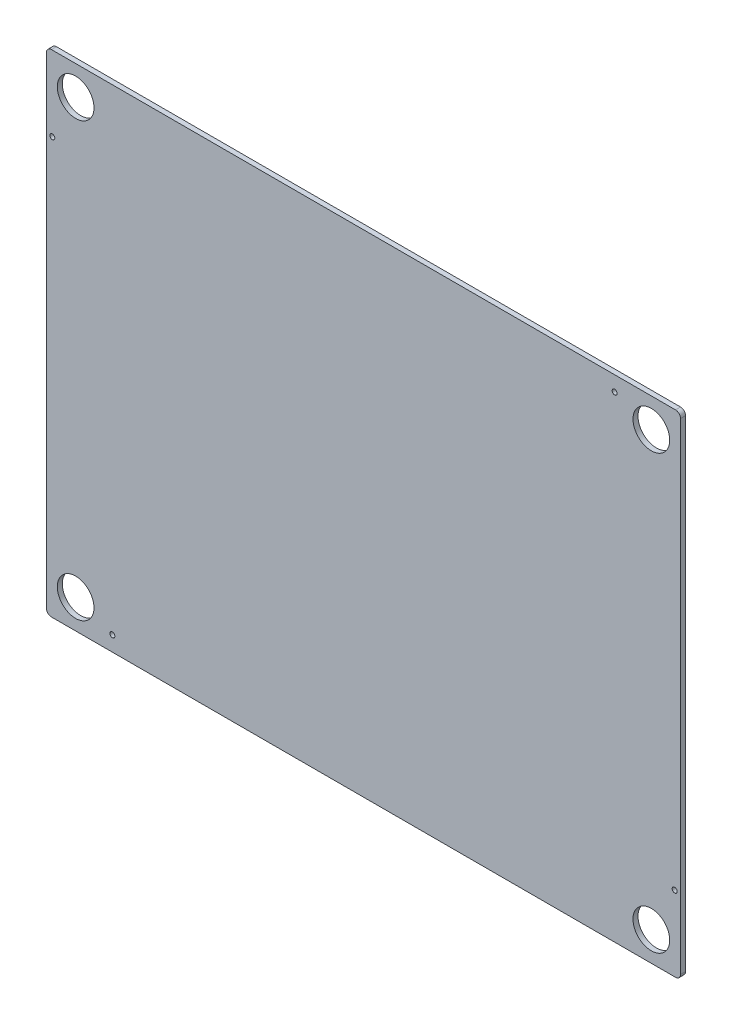
ISO-10303-21;
HEADER;
FILE_DESCRIPTION(('STEP AP214'),'2;1');
FILE_NAME('part.step','',(''),(''),'','','');
FILE_SCHEMA(('AUTOMOTIVE_DESIGN { 1 0 10303 214 1 1 1 1 }'));
ENDSEC;
DATA;
#1=APPLICATION_CONTEXT('core data for automotive mechanical design processes');
#2=APPLICATION_PROTOCOL_DEFINITION('international standard','automotive_design',2000,#1);
#3=PRODUCT_CONTEXT('',#1,'mechanical');
#4=PRODUCT('Part','Part','',(#3));
#5=PRODUCT_RELATED_PRODUCT_CATEGORY('part','',(#4));
#6=PRODUCT_DEFINITION_FORMATION('','',#4);
#7=PRODUCT_DEFINITION_CONTEXT('part definition',#1,'design');
#8=PRODUCT_DEFINITION('design','',#6,#7);
#9=PRODUCT_DEFINITION_SHAPE('','',#8);
#10=(LENGTH_UNIT() NAMED_UNIT(*) SI_UNIT(.MILLI.,.METRE.));
#11=(NAMED_UNIT(*) PLANE_ANGLE_UNIT() SI_UNIT($,.RADIAN.));
#12=(NAMED_UNIT(*) SI_UNIT($,.STERADIAN.) SOLID_ANGLE_UNIT());
#13=UNCERTAINTY_MEASURE_WITH_UNIT(LENGTH_MEASURE(1.E-05),#10,'distance_accuracy_value','');
#14=(GEOMETRIC_REPRESENTATION_CONTEXT(3) GLOBAL_UNCERTAINTY_ASSIGNED_CONTEXT((#13)) GLOBAL_UNIT_ASSIGNED_CONTEXT((#10,
#11,#12)) REPRESENTATION_CONTEXT('',''));
#15=CARTESIAN_POINT('',(0.,0.,0.));
#16=DIRECTION('',(0.,0.,1.));
#17=DIRECTION('',(1.,0.,0.));
#18=AXIS2_PLACEMENT_3D('',#15,#16,#17);
#19=CARTESIAN_POINT('',(0.,0.,3.));
#20=DIRECTION('',(0.,0.,1.));
#21=DIRECTION('',(1.,0.,0.));
#22=AXIS2_PLACEMENT_3D('',#19,#20,#21);
#23=PLANE('',#22);
#24=CARTESIAN_POINT('',(-150.499999999996,-138.250000000009,3.));
#25=DIRECTION('',(0.,0.,1.));
#26=DIRECTION('',(1.,0.,0.));
#27=AXIS2_PLACEMENT_3D('',#24,#25,#26);
#28=CIRCLE('',#27,1.49999999999875);
#29=CARTESIAN_POINT('',(-148.999999999997,-138.250000000009,3.));
#30=VERTEX_POINT('',#29);
#31=EDGE_CURVE('E216',#30,#30,#28,.T.);
#32=ORIENTED_EDGE('',*,*,#31,.F.);
#33=EDGE_LOOP('',(#32));
#34=FACE_BOUND('',#33,.T.);
#35=CARTESIAN_POINT('',(150.500000000004,138.249999999999,3.));
#36=DIRECTION('',(0.,0.,1.));
#37=DIRECTION('',(1.,0.,0.));
#38=AXIS2_PLACEMENT_3D('',#35,#36,#37);
#39=CIRCLE('',#38,1.50000000001802);
#40=CARTESIAN_POINT('',(152.000000000022,138.249999999999,3.));
#41=VERTEX_POINT('',#40);
#42=EDGE_CURVE('E204',#41,#41,#39,.T.);
#43=ORIENTED_EDGE('',*,*,#42,.F.);
#44=EDGE_LOOP('',(#43));
#45=FACE_BOUND('',#44,.T.);
#46=CARTESIAN_POINT('',(172.5,-129.749999999997,3.));
#47=DIRECTION('',(0.,0.,1.));
#48=DIRECTION('',(1.,0.,0.));
#49=AXIS2_PLACEMENT_3D('',#46,#47,#48);
#50=CIRCLE('',#49,11.);
#51=CARTESIAN_POINT('',(183.5,-129.749999999997,3.));
#52=VERTEX_POINT('',#51);
#53=EDGE_CURVE('E192',#52,#52,#50,.T.);
#54=ORIENTED_EDGE('',*,*,#53,.F.);
#55=EDGE_LOOP('',(#54));
#56=FACE_BOUND('',#55,.T.);
#57=CARTESIAN_POINT('',(-172.5,129.749999999997,3.));
#58=DIRECTION('',(0.,0.,1.));
#59=DIRECTION('',(1.,0.,0.));
#60=AXIS2_PLACEMENT_3D('',#57,#58,#59);
#61=CIRCLE('',#60,11.);
#62=CARTESIAN_POINT('',(-161.5,129.749999999997,3.));
#63=VERTEX_POINT('',#62);
#64=EDGE_CURVE('E182',#63,#63,#61,.T.);
#65=ORIENTED_EDGE('',*,*,#64,.F.);
#66=EDGE_LOOP('',(#65));
#67=FACE_BOUND('',#66,.T.);
#68=DIRECTION('',(1.,0.,0.));
#69=VECTOR('',#68,1.);
#70=CARTESIAN_POINT('',(190.,-147.250000000003,3.));
#71=LINE('',#70,#69);
#72=CARTESIAN_POINT('',(-187.,-147.250000000003,3.));
#73=VERTEX_POINT('',#72);
#74=CARTESIAN_POINT('',(187.,-147.250000000003,3.));
#75=VERTEX_POINT('',#74);
#76=EDGE_CURVE('E173',#73,#75,#71,.T.);
#77=ORIENTED_EDGE('',*,*,#76,.T.);
#78=CARTESIAN_POINT('',(187.,-144.250000000003,3.));
#79=DIRECTION('',(0.,0.,1.));
#80=DIRECTION('',(1.,0.,0.));
#81=AXIS2_PLACEMENT_3D('',#78,#79,#80);
#82=CIRCLE('',#81,3.);
#83=CARTESIAN_POINT('',(190.,-144.250000000003,3.));
#84=VERTEX_POINT('',#83);
#85=EDGE_CURVE('E151',#75,#84,#82,.T.);
#86=ORIENTED_EDGE('',*,*,#85,.T.);
#87=DIRECTION('',(0.,1.,0.));
#88=VECTOR('',#87,1.);
#89=CARTESIAN_POINT('',(190.,-147.250000000003,3.));
#90=LINE('',#89,#88);
#91=CARTESIAN_POINT('',(190.,144.249999999997,3.));
#92=VERTEX_POINT('',#91);
#93=EDGE_CURVE('E121',#84,#92,#90,.T.);
#94=ORIENTED_EDGE('',*,*,#93,.T.);
#95=CARTESIAN_POINT('',(187.,144.249999999997,3.));
#96=DIRECTION('',(0.,0.,1.));
#97=DIRECTION('',(1.,0.,0.));
#98=AXIS2_PLACEMENT_3D('',#95,#96,#97);
#99=CIRCLE('',#98,3.);
#100=CARTESIAN_POINT('',(187.,147.249999999997,3.));
#101=VERTEX_POINT('',#100);
#102=EDGE_CURVE('E57',#92,#101,#99,.T.);
#103=ORIENTED_EDGE('',*,*,#102,.T.);
#104=DIRECTION('',(-1.,0.,0.));
#105=VECTOR('',#104,1.);
#106=CARTESIAN_POINT('',(190.,147.249999999997,3.));
#107=LINE('',#106,#105);
#108=CARTESIAN_POINT('',(-187.,147.249999999997,3.));
#109=VERTEX_POINT('',#108);
#110=EDGE_CURVE('E137',#101,#109,#107,.T.);
#111=ORIENTED_EDGE('',*,*,#110,.T.);
#112=CARTESIAN_POINT('',(-187.,144.249999999997,3.));
#113=DIRECTION('',(0.,0.,1.));
#114=DIRECTION('',(1.,0.,0.));
#115=AXIS2_PLACEMENT_3D('',#112,#113,#114);
#116=CIRCLE('',#115,3.);
#117=CARTESIAN_POINT('',(-190.,144.249999999997,3.));
#118=VERTEX_POINT('',#117);
#119=EDGE_CURVE('E147',#109,#118,#116,.T.);
#120=ORIENTED_EDGE('',*,*,#119,.T.);
#121=DIRECTION('',(0.,-1.,0.));
#122=VECTOR('',#121,1.);
#123=CARTESIAN_POINT('',(-190.,-147.250000000003,3.));
#124=LINE('',#123,#122);
#125=CARTESIAN_POINT('',(-190.,-144.250000000003,3.));
#126=VERTEX_POINT('',#125);
#127=EDGE_CURVE('E131',#118,#126,#124,.T.);
#128=ORIENTED_EDGE('',*,*,#127,.T.);
#129=CARTESIAN_POINT('',(-187.,-144.250000000003,3.));
#130=DIRECTION('',(0.,0.,1.));
#131=DIRECTION('',(1.,0.,0.));
#132=AXIS2_PLACEMENT_3D('',#129,#130,#131);
#133=CIRCLE('',#132,3.);
#134=EDGE_CURVE('E149',#126,#73,#133,.T.);
#135=ORIENTED_EDGE('',*,*,#134,.T.);
#136=EDGE_LOOP('',(#77,#86,#94,#103,#111,#120,#128,#135));
#137=FACE_BOUND('',#136,.T.);
#138=CARTESIAN_POINT('',(172.5,129.749999999997,3.));
#139=DIRECTION('',(0.,0.,1.));
#140=DIRECTION('',(-1.,0.,0.));
#141=AXIS2_PLACEMENT_3D('',#138,#139,#140);
#142=CIRCLE('',#141,11.);
#143=CARTESIAN_POINT('',(161.5,129.749999999997,3.));
#144=VERTEX_POINT('',#143);
#145=EDGE_CURVE('E187',#144,#144,#142,.T.);
#146=ORIENTED_EDGE('',*,*,#145,.F.);
#147=EDGE_LOOP('',(#146));
#148=FACE_BOUND('',#147,.T.);
#149=CARTESIAN_POINT('',(-172.5,-129.749999999997,3.));
#150=DIRECTION('',(0.,0.,1.));
#151=DIRECTION('',(-1.,0.,0.));
#152=AXIS2_PLACEMENT_3D('',#149,#150,#151);
#153=CIRCLE('',#152,11.);
#154=CARTESIAN_POINT('',(-183.5,-129.749999999997,3.));
#155=VERTEX_POINT('',#154);
#156=EDGE_CURVE('E198',#155,#155,#153,.T.);
#157=ORIENTED_EDGE('',*,*,#156,.F.);
#158=EDGE_LOOP('',(#157));
#159=FACE_BOUND('',#158,.T.);
#160=CARTESIAN_POINT('',(-186.499999999993,102.25,3.));
#161=DIRECTION('',(0.,0.,1.));
#162=DIRECTION('',(1.,0.,0.));
#163=AXIS2_PLACEMENT_3D('',#160,#161,#162);
#164=CIRCLE('',#163,1.49999999999387);
#165=CARTESIAN_POINT('',(-185.,102.25,3.));
#166=VERTEX_POINT('',#165);
#167=EDGE_CURVE('E210',#166,#166,#164,.T.);
#168=ORIENTED_EDGE('',*,*,#167,.F.);
#169=EDGE_LOOP('',(#168));
#170=FACE_BOUND('',#169,.T.);
#171=CARTESIAN_POINT('',(186.500000000006,-102.250000000003,3.));
#172=DIRECTION('',(0.,0.,1.));
#173=DIRECTION('',(1.,0.,0.));
#174=AXIS2_PLACEMENT_3D('',#171,#172,#173);
#175=CIRCLE('',#174,1.49999999999547);
#176=CARTESIAN_POINT('',(188.000000000001,-102.250000000003,3.));
#177=VERTEX_POINT('',#176);
#178=EDGE_CURVE('E222',#177,#177,#175,.T.);
#179=ORIENTED_EDGE('',*,*,#178,.F.);
#180=EDGE_LOOP('',(#179));
#181=FACE_BOUND('',#180,.T.);
#182=ADVANCED_FACE('F37',(#34,#45,#56,#67,#137,#148,#159,#170,#181),#23,.T.);
#183=CARTESIAN_POINT('',(0.,0.,0.));
#184=DIRECTION('',(0.,0.,1.));
#185=DIRECTION('',(1.,0.,0.));
#186=AXIS2_PLACEMENT_3D('',#183,#184,#185);
#187=PLANE('',#186);
#188=DIRECTION('',(0.,1.,0.));
#189=VECTOR('',#188,1.);
#190=CARTESIAN_POINT('',(190.,-147.250000000003,0.));
#191=LINE('',#190,#189);
#192=CARTESIAN_POINT('',(190.,-144.250000000003,0.));
#193=VERTEX_POINT('',#192);
#194=CARTESIAN_POINT('',(190.,144.249999999997,0.));
#195=VERTEX_POINT('',#194);
#196=EDGE_CURVE('E119',#193,#195,#191,.T.);
#197=ORIENTED_EDGE('',*,*,#196,.F.);
#198=CARTESIAN_POINT('',(187.,-144.250000000003,0.));
#199=DIRECTION('',(0.,0.,1.));
#200=DIRECTION('',(1.,0.,0.));
#201=AXIS2_PLACEMENT_3D('',#198,#199,#200);
#202=CIRCLE('',#201,3.);
#203=CARTESIAN_POINT('',(187.,-147.250000000003,0.));
#204=VERTEX_POINT('',#203);
#205=EDGE_CURVE('E102',#193,#204,#202,.F.);
#206=ORIENTED_EDGE('',*,*,#205,.T.);
#207=DIRECTION('',(1.,0.,0.));
#208=VECTOR('',#207,1.);
#209=CARTESIAN_POINT('',(190.,-147.250000000003,0.));
#210=LINE('',#209,#208);
#211=CARTESIAN_POINT('',(-187.,-147.250000000003,0.));
#212=VERTEX_POINT('',#211);
#213=EDGE_CURVE('E129',#212,#204,#210,.T.);
#214=ORIENTED_EDGE('',*,*,#213,.F.);
#215=CARTESIAN_POINT('',(-187.,-144.250000000003,0.));
#216=DIRECTION('',(0.,0.,1.));
#217=DIRECTION('',(1.,0.,0.));
#218=AXIS2_PLACEMENT_3D('',#215,#216,#217);
#219=CIRCLE('',#218,3.);
#220=CARTESIAN_POINT('',(-190.,-144.250000000003,0.));
#221=VERTEX_POINT('',#220);
#222=EDGE_CURVE('E113',#212,#221,#219,.F.);
#223=ORIENTED_EDGE('',*,*,#222,.T.);
#224=DIRECTION('',(0.,-1.,0.));
#225=VECTOR('',#224,1.);
#226=CARTESIAN_POINT('',(-190.,-147.250000000003,0.));
#227=LINE('',#226,#225);
#228=CARTESIAN_POINT('',(-190.,144.249999999997,0.));
#229=VERTEX_POINT('',#228);
#230=EDGE_CURVE('E133',#229,#221,#227,.T.);
#231=ORIENTED_EDGE('',*,*,#230,.F.);
#232=CARTESIAN_POINT('',(-187.,144.249999999997,0.));
#233=DIRECTION('',(0.,0.,1.));
#234=DIRECTION('',(1.,0.,0.));
#235=AXIS2_PLACEMENT_3D('',#232,#233,#234);
#236=CIRCLE('',#235,3.);
#237=CARTESIAN_POINT('',(-187.,147.249999999997,0.));
#238=VERTEX_POINT('',#237);
#239=EDGE_CURVE('E140',#229,#238,#236,.F.);
#240=ORIENTED_EDGE('',*,*,#239,.T.);
#241=DIRECTION('',(-1.,0.,0.));
#242=VECTOR('',#241,1.);
#243=CARTESIAN_POINT('',(190.,147.249999999997,0.));
#244=LINE('',#243,#242);
#245=CARTESIAN_POINT('',(187.,147.249999999997,0.));
#246=VERTEX_POINT('',#245);
#247=EDGE_CURVE('E128',#246,#238,#244,.T.);
#248=ORIENTED_EDGE('',*,*,#247,.F.);
#249=CARTESIAN_POINT('',(187.,144.249999999997,0.));
#250=DIRECTION('',(0.,0.,1.));
#251=DIRECTION('',(1.,0.,0.));
#252=AXIS2_PLACEMENT_3D('',#249,#250,#251);
#253=CIRCLE('',#252,3.);
#254=EDGE_CURVE('E122',#246,#195,#253,.F.);
#255=ORIENTED_EDGE('',*,*,#254,.T.);
#256=EDGE_LOOP('',(#197,#206,#214,#223,#231,#240,#248,#255));
#257=FACE_BOUND('',#256,.T.);
#258=CARTESIAN_POINT('',(-172.5,129.749999999997,0.));
#259=DIRECTION('',(0.,0.,1.));
#260=DIRECTION('',(1.,0.,0.));
#261=AXIS2_PLACEMENT_3D('',#258,#259,#260);
#262=CIRCLE('',#261,11.);
#263=CARTESIAN_POINT('',(-161.5,129.749999999997,0.));
#264=VERTEX_POINT('',#263);
#265=EDGE_CURVE('E178',#264,#264,#262,.T.);
#266=ORIENTED_EDGE('',*,*,#265,.T.);
#267=EDGE_LOOP('',(#266));
#268=FACE_BOUND('',#267,.T.);
#269=CARTESIAN_POINT('',(172.5,129.749999999997,0.));
#270=DIRECTION('',(0.,0.,1.));
#271=DIRECTION('',(-1.,0.,0.));
#272=AXIS2_PLACEMENT_3D('',#269,#270,#271);
#273=CIRCLE('',#272,11.);
#274=CARTESIAN_POINT('',(161.5,129.749999999997,0.));
#275=VERTEX_POINT('',#274);
#276=EDGE_CURVE('E189',#275,#275,#273,.T.);
#277=ORIENTED_EDGE('',*,*,#276,.T.);
#278=EDGE_LOOP('',(#277));
#279=FACE_BOUND('',#278,.T.);
#280=CARTESIAN_POINT('',(172.5,-129.749999999997,0.));
#281=DIRECTION('',(0.,0.,1.));
#282=DIRECTION('',(1.,0.,0.));
#283=AXIS2_PLACEMENT_3D('',#280,#281,#282);
#284=CIRCLE('',#283,11.);
#285=CARTESIAN_POINT('',(183.5,-129.749999999997,0.));
#286=VERTEX_POINT('',#285);
#287=EDGE_CURVE('E195',#286,#286,#284,.T.);
#288=ORIENTED_EDGE('',*,*,#287,.T.);
#289=EDGE_LOOP('',(#288));
#290=FACE_BOUND('',#289,.T.);
#291=CARTESIAN_POINT('',(-172.5,-129.749999999997,0.));
#292=DIRECTION('',(0.,0.,1.));
#293=DIRECTION('',(-1.,0.,0.));
#294=AXIS2_PLACEMENT_3D('',#291,#292,#293);
#295=CIRCLE('',#294,11.);
#296=CARTESIAN_POINT('',(-183.5,-129.749999999997,0.));
#297=VERTEX_POINT('',#296);
#298=EDGE_CURVE('E201',#297,#297,#295,.T.);
#299=ORIENTED_EDGE('',*,*,#298,.T.);
#300=EDGE_LOOP('',(#299));
#301=FACE_BOUND('',#300,.T.);
#302=CARTESIAN_POINT('',(150.500000000004,138.249999999999,0.));
#303=DIRECTION('',(0.,0.,1.));
#304=DIRECTION('',(1.,0.,0.));
#305=AXIS2_PLACEMENT_3D('',#302,#303,#304);
#306=CIRCLE('',#305,1.50000000001802);
#307=CARTESIAN_POINT('',(152.000000000022,138.249999999999,0.));
#308=VERTEX_POINT('',#307);
#309=EDGE_CURVE('E207',#308,#308,#306,.T.);
#310=ORIENTED_EDGE('',*,*,#309,.T.);
#311=EDGE_LOOP('',(#310));
#312=FACE_BOUND('',#311,.T.);
#313=CARTESIAN_POINT('',(-186.499999999993,102.25,0.));
#314=DIRECTION('',(0.,0.,1.));
#315=DIRECTION('',(1.,0.,0.));
#316=AXIS2_PLACEMENT_3D('',#313,#314,#315);
#317=CIRCLE('',#316,1.49999999999387);
#318=CARTESIAN_POINT('',(-185.,102.25,0.));
#319=VERTEX_POINT('',#318);
#320=EDGE_CURVE('E213',#319,#319,#317,.T.);
#321=ORIENTED_EDGE('',*,*,#320,.T.);
#322=EDGE_LOOP('',(#321));
#323=FACE_BOUND('',#322,.T.);
#324=CARTESIAN_POINT('',(-150.499999999996,-138.250000000009,0.));
#325=DIRECTION('',(0.,0.,1.));
#326=DIRECTION('',(1.,0.,0.));
#327=AXIS2_PLACEMENT_3D('',#324,#325,#326);
#328=CIRCLE('',#327,1.49999999999875);
#329=CARTESIAN_POINT('',(-148.999999999997,-138.250000000009,0.));
#330=VERTEX_POINT('',#329);
#331=EDGE_CURVE('E219',#330,#330,#328,.T.);
#332=ORIENTED_EDGE('',*,*,#331,.T.);
#333=EDGE_LOOP('',(#332));
#334=FACE_BOUND('',#333,.T.);
#335=CARTESIAN_POINT('',(186.500000000006,-102.250000000003,0.));
#336=DIRECTION('',(0.,0.,1.));
#337=DIRECTION('',(1.,0.,0.));
#338=AXIS2_PLACEMENT_3D('',#335,#336,#337);
#339=CIRCLE('',#338,1.49999999999547);
#340=CARTESIAN_POINT('',(188.000000000001,-102.250000000003,0.));
#341=VERTEX_POINT('',#340);
#342=EDGE_CURVE('E225',#341,#341,#339,.T.);
#343=ORIENTED_EDGE('',*,*,#342,.T.);
#344=EDGE_LOOP('',(#343));
#345=FACE_BOUND('',#344,.T.);
#346=ADVANCED_FACE('F125',(#257,#268,#279,#290,#301,#312,#323,#334,#345),#187,.F.);
#347=CARTESIAN_POINT('',(-190.,-147.250000000003,3.));
#348=DIRECTION('',(1.,0.,0.));
#349=DIRECTION('',(0.,1.,0.));
#350=AXIS2_PLACEMENT_3D('',#347,#348,#349);
#351=PLANE('',#350);
#352=ORIENTED_EDGE('',*,*,#230,.T.);
#353=DIRECTION('',(0.,0.,-1.));
#354=VECTOR('',#353,1.);
#355=CARTESIAN_POINT('',(-190.,-144.250000000003,3.));
#356=LINE('',#355,#354);
#357=EDGE_CURVE('E156',#221,#126,#356,.F.);
#358=ORIENTED_EDGE('',*,*,#357,.T.);
#359=ORIENTED_EDGE('',*,*,#127,.F.);
#360=DIRECTION('',(0.,0.,-1.));
#361=VECTOR('',#360,1.);
#362=CARTESIAN_POINT('',(-190.,144.249999999997,3.));
#363=LINE('',#362,#361);
#364=EDGE_CURVE('E153',#118,#229,#363,.T.);
#365=ORIENTED_EDGE('',*,*,#364,.T.);
#366=EDGE_LOOP('',(#352,#358,#359,#365));
#367=FACE_BOUND('',#366,.T.);
#368=ADVANCED_FACE('F169',(#367),#351,.F.);
#369=CARTESIAN_POINT('',(190.,-147.250000000003,3.));
#370=DIRECTION('',(0.,1.,0.));
#371=DIRECTION('',(-1.,0.,0.));
#372=AXIS2_PLACEMENT_3D('',#369,#370,#371);
#373=PLANE('',#372);
#374=ORIENTED_EDGE('',*,*,#213,.T.);
#375=DIRECTION('',(0.,0.,-1.));
#376=VECTOR('',#375,1.);
#377=CARTESIAN_POINT('',(187.,-147.250000000003,3.));
#378=LINE('',#377,#376);
#379=EDGE_CURVE('E107',#204,#75,#378,.F.);
#380=ORIENTED_EDGE('',*,*,#379,.T.);
#381=ORIENTED_EDGE('',*,*,#76,.F.);
#382=DIRECTION('',(0.,0.,-1.));
#383=VECTOR('',#382,1.);
#384=CARTESIAN_POINT('',(-187.,-147.250000000003,3.));
#385=LINE('',#384,#383);
#386=EDGE_CURVE('E112',#73,#212,#385,.T.);
#387=ORIENTED_EDGE('',*,*,#386,.T.);
#388=EDGE_LOOP('',(#374,#380,#381,#387));
#389=FACE_BOUND('',#388,.T.);
#390=ADVANCED_FACE('F251',(#389),#373,.F.);
#391=CARTESIAN_POINT('',(190.,-147.250000000003,3.));
#392=DIRECTION('',(-1.,0.,0.));
#393=DIRECTION('',(0.,-1.,0.));
#394=AXIS2_PLACEMENT_3D('',#391,#392,#393);
#395=PLANE('',#394);
#396=ORIENTED_EDGE('',*,*,#93,.F.);
#397=DIRECTION('',(0.,0.,-1.));
#398=VECTOR('',#397,1.);
#399=CARTESIAN_POINT('',(190.,-144.250000000003,3.));
#400=LINE('',#399,#398);
#401=EDGE_CURVE('E106',#84,#193,#400,.T.);
#402=ORIENTED_EDGE('',*,*,#401,.T.);
#403=ORIENTED_EDGE('',*,*,#196,.T.);
#404=DIRECTION('',(0.,0.,-1.));
#405=VECTOR('',#404,1.);
#406=CARTESIAN_POINT('',(190.,144.249999999997,3.));
#407=LINE('',#406,#405);
#408=EDGE_CURVE('E123',#195,#92,#407,.F.);
#409=ORIENTED_EDGE('',*,*,#408,.T.);
#410=EDGE_LOOP('',(#396,#402,#403,#409));
#411=FACE_BOUND('',#410,.T.);
#412=ADVANCED_FACE('F118',(#411),#395,.F.);
#413=CARTESIAN_POINT('',(190.,147.249999999997,3.));
#414=DIRECTION('',(0.,-1.,0.));
#415=DIRECTION('',(1.,0.,0.));
#416=AXIS2_PLACEMENT_3D('',#413,#414,#415);
#417=PLANE('',#416);
#418=ORIENTED_EDGE('',*,*,#247,.T.);
#419=DIRECTION('',(0.,0.,-1.));
#420=VECTOR('',#419,1.);
#421=CARTESIAN_POINT('',(-187.,147.249999999997,3.));
#422=LINE('',#421,#420);
#423=EDGE_CURVE('E11',#238,#109,#422,.F.);
#424=ORIENTED_EDGE('',*,*,#423,.T.);
#425=ORIENTED_EDGE('',*,*,#110,.F.);
#426=DIRECTION('',(0.,0.,-1.));
#427=VECTOR('',#426,1.);
#428=CARTESIAN_POINT('',(187.,147.249999999997,3.));
#429=LINE('',#428,#427);
#430=EDGE_CURVE('E45',#101,#246,#429,.T.);
#431=ORIENTED_EDGE('',*,*,#430,.T.);
#432=EDGE_LOOP('',(#418,#424,#425,#431));
#433=FACE_BOUND('',#432,.T.);
#434=ADVANCED_FACE('F159',(#433),#417,.F.);
#435=CARTESIAN_POINT('',(-172.5,129.749999999997,3.));
#436=DIRECTION('',(0.,0.,-1.));
#437=DIRECTION('',(-1.,0.,0.));
#438=AXIS2_PLACEMENT_3D('',#435,#436,#437);
#439=CYLINDRICAL_SURFACE('',#438,11.);
#440=ORIENTED_EDGE('',*,*,#64,.T.);
#441=EDGE_LOOP('',(#440));
#442=FACE_BOUND('',#441,.T.);
#443=ORIENTED_EDGE('',*,*,#265,.F.);
#444=EDGE_LOOP('',(#443));
#445=FACE_BOUND('',#444,.T.);
#446=ADVANCED_FACE('F244',(#442,#445),#439,.F.);
#447=CARTESIAN_POINT('',(172.5,129.749999999997,3.));
#448=DIRECTION('',(0.,0.,-1.));
#449=DIRECTION('',(-1.,0.,0.));
#450=AXIS2_PLACEMENT_3D('',#447,#448,#449);
#451=CYLINDRICAL_SURFACE('',#450,11.);
#452=ORIENTED_EDGE('',*,*,#145,.T.);
#453=EDGE_LOOP('',(#452));
#454=FACE_BOUND('',#453,.T.);
#455=ORIENTED_EDGE('',*,*,#276,.F.);
#456=EDGE_LOOP('',(#455));
#457=FACE_BOUND('',#456,.T.);
#458=ADVANCED_FACE('F306',(#454,#457),#451,.F.);
#459=CARTESIAN_POINT('',(172.5,-129.749999999997,3.));
#460=DIRECTION('',(0.,0.,-1.));
#461=DIRECTION('',(-1.,0.,0.));
#462=AXIS2_PLACEMENT_3D('',#459,#460,#461);
#463=CYLINDRICAL_SURFACE('',#462,11.);
#464=ORIENTED_EDGE('',*,*,#53,.T.);
#465=EDGE_LOOP('',(#464));
#466=FACE_BOUND('',#465,.T.);
#467=ORIENTED_EDGE('',*,*,#287,.F.);
#468=EDGE_LOOP('',(#467));
#469=FACE_BOUND('',#468,.T.);
#470=ADVANCED_FACE('F303',(#466,#469),#463,.F.);
#471=CARTESIAN_POINT('',(-172.5,-129.749999999997,3.));
#472=DIRECTION('',(0.,0.,-1.));
#473=DIRECTION('',(-1.,0.,0.));
#474=AXIS2_PLACEMENT_3D('',#471,#472,#473);
#475=CYLINDRICAL_SURFACE('',#474,11.);
#476=ORIENTED_EDGE('',*,*,#156,.T.);
#477=EDGE_LOOP('',(#476));
#478=FACE_BOUND('',#477,.T.);
#479=ORIENTED_EDGE('',*,*,#298,.F.);
#480=EDGE_LOOP('',(#479));
#481=FACE_BOUND('',#480,.T.);
#482=ADVANCED_FACE('F299',(#478,#481),#475,.F.);
#483=CARTESIAN_POINT('',(150.500000000004,138.249999999999,3.));
#484=DIRECTION('',(0.,0.,-1.));
#485=DIRECTION('',(-1.,0.,0.));
#486=AXIS2_PLACEMENT_3D('',#483,#484,#485);
#487=CYLINDRICAL_SURFACE('',#486,1.50000000001802);
#488=ORIENTED_EDGE('',*,*,#42,.T.);
#489=EDGE_LOOP('',(#488));
#490=FACE_BOUND('',#489,.T.);
#491=ORIENTED_EDGE('',*,*,#309,.F.);
#492=EDGE_LOOP('',(#491));
#493=FACE_BOUND('',#492,.T.);
#494=ADVANCED_FACE('F281',(#490,#493),#487,.F.);
#495=CARTESIAN_POINT('',(-186.499999999993,102.25,3.));
#496=DIRECTION('',(0.,0.,-1.));
#497=DIRECTION('',(-1.,0.,0.));
#498=AXIS2_PLACEMENT_3D('',#495,#496,#497);
#499=CYLINDRICAL_SURFACE('',#498,1.49999999999387);
#500=ORIENTED_EDGE('',*,*,#167,.T.);
#501=EDGE_LOOP('',(#500));
#502=FACE_BOUND('',#501,.T.);
#503=ORIENTED_EDGE('',*,*,#320,.F.);
#504=EDGE_LOOP('',(#503));
#505=FACE_BOUND('',#504,.T.);
#506=ADVANCED_FACE('F277',(#502,#505),#499,.F.);
#507=CARTESIAN_POINT('',(-150.499999999996,-138.250000000009,3.));
#508=DIRECTION('',(0.,0.,-1.));
#509=DIRECTION('',(-1.,0.,0.));
#510=AXIS2_PLACEMENT_3D('',#507,#508,#509);
#511=CYLINDRICAL_SURFACE('',#510,1.49999999999875);
#512=ORIENTED_EDGE('',*,*,#31,.T.);
#513=EDGE_LOOP('',(#512));
#514=FACE_BOUND('',#513,.T.);
#515=ORIENTED_EDGE('',*,*,#331,.F.);
#516=EDGE_LOOP('',(#515));
#517=FACE_BOUND('',#516,.T.);
#518=ADVANCED_FACE('F280',(#514,#517),#511,.F.);
#519=CARTESIAN_POINT('',(186.500000000006,-102.250000000003,3.));
#520=DIRECTION('',(0.,0.,-1.));
#521=DIRECTION('',(-1.,0.,0.));
#522=AXIS2_PLACEMENT_3D('',#519,#520,#521);
#523=CYLINDRICAL_SURFACE('',#522,1.49999999999547);
#524=ORIENTED_EDGE('',*,*,#178,.T.);
#525=EDGE_LOOP('',(#524));
#526=FACE_BOUND('',#525,.T.);
#527=ORIENTED_EDGE('',*,*,#342,.F.);
#528=EDGE_LOOP('',(#527));
#529=FACE_BOUND('',#528,.T.);
#530=ADVANCED_FACE('F231',(#526,#529),#523,.F.);
#531=CARTESIAN_POINT('',(187.,-144.250000000003,3.));
#532=DIRECTION('',(0.,0.,-1.));
#533=DIRECTION('',(-1.,0.,0.));
#534=AXIS2_PLACEMENT_3D('',#531,#532,#533);
#535=CYLINDRICAL_SURFACE('',#534,3.);
#536=ORIENTED_EDGE('',*,*,#85,.F.);
#537=ORIENTED_EDGE('',*,*,#379,.F.);
#538=ORIENTED_EDGE('',*,*,#205,.F.);
#539=ORIENTED_EDGE('',*,*,#401,.F.);
#540=EDGE_LOOP('',(#536,#537,#538,#539));
#541=FACE_BOUND('',#540,.T.);
#542=ADVANCED_FACE('F105',(#541),#535,.T.);
#543=CARTESIAN_POINT('',(-187.,-144.250000000003,3.));
#544=DIRECTION('',(0.,0.,-1.));
#545=DIRECTION('',(-1.,0.,0.));
#546=AXIS2_PLACEMENT_3D('',#543,#544,#545);
#547=CYLINDRICAL_SURFACE('',#546,3.);
#548=ORIENTED_EDGE('',*,*,#134,.F.);
#549=ORIENTED_EDGE('',*,*,#357,.F.);
#550=ORIENTED_EDGE('',*,*,#222,.F.);
#551=ORIENTED_EDGE('',*,*,#386,.F.);
#552=EDGE_LOOP('',(#548,#549,#550,#551));
#553=FACE_BOUND('',#552,.T.);
#554=ADVANCED_FACE('F259',(#553),#547,.T.);
#555=CARTESIAN_POINT('',(-187.,144.249999999997,3.));
#556=DIRECTION('',(0.,0.,-1.));
#557=DIRECTION('',(-1.,0.,0.));
#558=AXIS2_PLACEMENT_3D('',#555,#556,#557);
#559=CYLINDRICAL_SURFACE('',#558,3.);
#560=ORIENTED_EDGE('',*,*,#119,.F.);
#561=ORIENTED_EDGE('',*,*,#423,.F.);
#562=ORIENTED_EDGE('',*,*,#239,.F.);
#563=ORIENTED_EDGE('',*,*,#364,.F.);
#564=EDGE_LOOP('',(#560,#561,#562,#563));
#565=FACE_BOUND('',#564,.T.);
#566=ADVANCED_FACE('F166',(#565),#559,.T.);
#567=CARTESIAN_POINT('',(187.,144.249999999997,3.));
#568=DIRECTION('',(0.,0.,-1.));
#569=DIRECTION('',(-1.,0.,0.));
#570=AXIS2_PLACEMENT_3D('',#567,#568,#569);
#571=CYLINDRICAL_SURFACE('',#570,3.);
#572=ORIENTED_EDGE('',*,*,#102,.F.);
#573=ORIENTED_EDGE('',*,*,#408,.F.);
#574=ORIENTED_EDGE('',*,*,#254,.F.);
#575=ORIENTED_EDGE('',*,*,#430,.F.);
#576=EDGE_LOOP('',(#572,#573,#574,#575));
#577=FACE_BOUND('',#576,.T.);
#578=ADVANCED_FACE('F39',(#577),#571,.T.);
#579=CLOSED_SHELL('',(#182,#346,#368,#390,#412,#434,#446,#458,#470,#482,#494,#506,#518,#530,
#542,#554,#566,#578));
#580=MANIFOLD_SOLID_BREP('B2',#579);
#581=ADVANCED_BREP_SHAPE_REPRESENTATION('',(#18,#580),#14);
#582=SHAPE_DEFINITION_REPRESENTATION(#9,#581);
ENDSEC;
END-ISO-10303-21;
